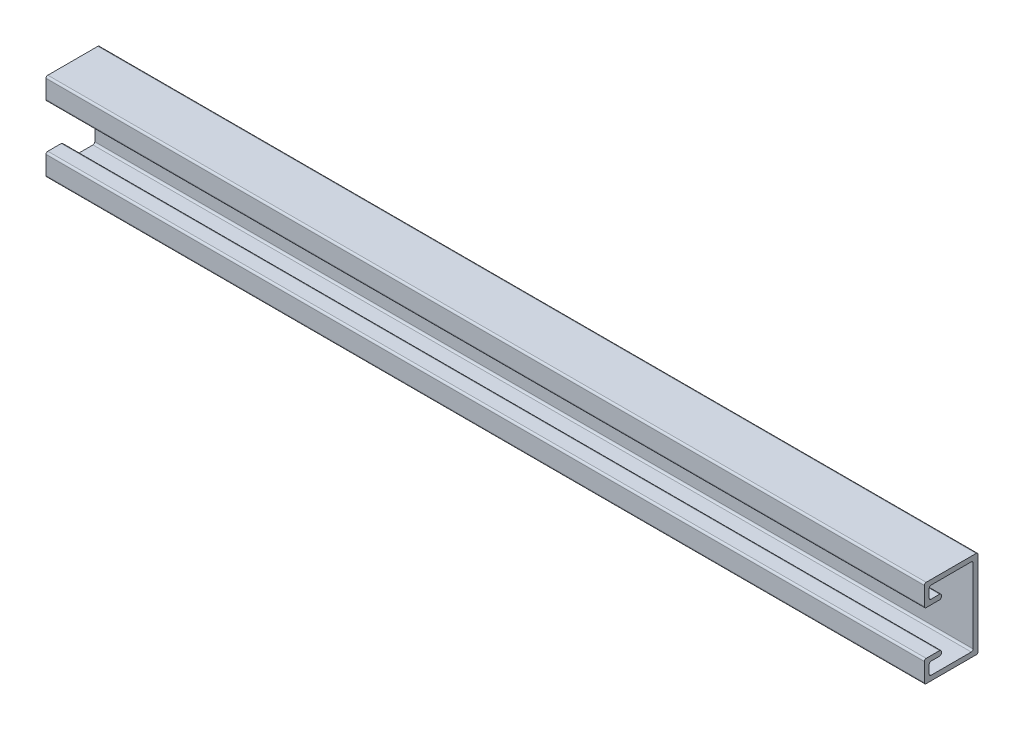
ISO-10303-21;
HEADER;
FILE_DESCRIPTION(('STEP AP214'),'2;1');
FILE_NAME('part.step','',(''),(''),'','','');
FILE_SCHEMA(('AUTOMOTIVE_DESIGN { 1 0 10303 214 1 1 1 1 }'));
ENDSEC;
DATA;
#1=APPLICATION_CONTEXT('core data for automotive mechanical design processes');
#2=APPLICATION_PROTOCOL_DEFINITION('international standard','automotive_design',2000,#1);
#3=PRODUCT_CONTEXT('',#1,'mechanical');
#4=PRODUCT('Part','Part','',(#3));
#5=PRODUCT_RELATED_PRODUCT_CATEGORY('part','',(#4));
#6=PRODUCT_DEFINITION_FORMATION('','',#4);
#7=PRODUCT_DEFINITION_CONTEXT('part definition',#1,'design');
#8=PRODUCT_DEFINITION('design','',#6,#7);
#9=PRODUCT_DEFINITION_SHAPE('','',#8);
#10=(LENGTH_UNIT() NAMED_UNIT(*) SI_UNIT(.MILLI.,.METRE.));
#11=(NAMED_UNIT(*) PLANE_ANGLE_UNIT() SI_UNIT($,.RADIAN.));
#12=(NAMED_UNIT(*) SI_UNIT($,.STERADIAN.) SOLID_ANGLE_UNIT());
#13=UNCERTAINTY_MEASURE_WITH_UNIT(LENGTH_MEASURE(1.E-05),#10,'distance_accuracy_value','');
#14=(GEOMETRIC_REPRESENTATION_CONTEXT(3) GLOBAL_UNCERTAINTY_ASSIGNED_CONTEXT((#13)) GLOBAL_UNIT_ASSIGNED_CONTEXT((#10,
#11,#12)) REPRESENTATION_CONTEXT('',''));
#15=CARTESIAN_POINT('',(0.,0.,0.));
#16=DIRECTION('',(0.,0.,1.));
#17=DIRECTION('',(1.,0.,0.));
#18=AXIS2_PLACEMENT_3D('',#15,#16,#17);
#19=CARTESIAN_POINT('',(914.4,12.7,45.72));
#20=DIRECTION('',(0.,1.,0.));
#21=DIRECTION('',(0.,0.,1.));
#22=AXIS2_PLACEMENT_3D('',#19,#20,#21);
#23=PLANE('',#22);
#24=DIRECTION('',(0.,0.,-1.));
#25=VECTOR('',#24,1.);
#26=CARTESIAN_POINT('',(914.4,12.7,45.72));
#27=LINE('',#26,#25);
#28=CARTESIAN_POINT('',(914.4,12.7,43.815));
#29=VERTEX_POINT('',#28);
#30=CARTESIAN_POINT('',(914.4,12.7,34.925));
#31=VERTEX_POINT('',#30);
#32=EDGE_CURVE('E263',#29,#31,#27,.T.);
#33=ORIENTED_EDGE('',*,*,#32,.F.);
#34=DIRECTION('',(-1.,0.,0.));
#35=VECTOR('',#34,1.);
#36=CARTESIAN_POINT('',(0.,12.7,43.815));
#37=LINE('',#36,#35);
#38=CARTESIAN_POINT('',(0.,12.7,43.815));
#39=VERTEX_POINT('',#38);
#40=EDGE_CURVE('E248',#29,#39,#37,.T.);
#41=ORIENTED_EDGE('',*,*,#40,.T.);
#42=DIRECTION('',(0.,0.,-1.));
#43=VECTOR('',#42,1.);
#44=CARTESIAN_POINT('',(0.,12.7,45.72));
#45=LINE('',#44,#43);
#46=CARTESIAN_POINT('',(0.,12.7,34.925));
#47=VERTEX_POINT('',#46);
#48=EDGE_CURVE('E260',#39,#47,#45,.T.);
#49=ORIENTED_EDGE('',*,*,#48,.T.);
#50=DIRECTION('',(-1.,0.,0.));
#51=VECTOR('',#50,1.);
#52=CARTESIAN_POINT('',(914.4,12.7,34.925));
#53=LINE('',#52,#51);
#54=EDGE_CURVE('E265',#47,#31,#53,.F.);
#55=ORIENTED_EDGE('',*,*,#54,.T.);
#56=EDGE_LOOP('',(#33,#41,#49,#55));
#57=FACE_BOUND('',#56,.T.);
#58=ADVANCED_FACE('F34',(#57),#23,.F.);
#59=CARTESIAN_POINT('',(914.4,17.78,33.02));
#60=DIRECTION('',(0.,0.,-1.));
#61=DIRECTION('',(-1.,0.,0.));
#62=AXIS2_PLACEMENT_3D('',#59,#60,#61);
#63=PLANE('',#62);
#64=DIRECTION('',(0.,-1.,0.));
#65=VECTOR('',#64,1.);
#66=CARTESIAN_POINT('',(914.4,17.78,33.02));
#67=LINE('',#66,#65);
#68=CARTESIAN_POINT('',(914.4,15.875,33.02));
#69=VERTEX_POINT('',#68);
#70=CARTESIAN_POINT('',(914.4,14.605,33.02));
#71=VERTEX_POINT('',#70);
#72=EDGE_CURVE('E496',#69,#71,#67,.T.);
#73=ORIENTED_EDGE('',*,*,#72,.T.);
#74=DIRECTION('',(-1.,0.,0.));
#75=VECTOR('',#74,1.);
#76=CARTESIAN_POINT('',(0.,14.605,33.02));
#77=LINE('',#76,#75);
#78=CARTESIAN_POINT('',(0.,14.605,33.02));
#79=VERTEX_POINT('',#78);
#80=EDGE_CURVE('E406',#71,#79,#77,.T.);
#81=ORIENTED_EDGE('',*,*,#80,.T.);
#82=DIRECTION('',(0.,-1.,0.));
#83=VECTOR('',#82,1.);
#84=CARTESIAN_POINT('',(0.,17.78,33.02));
#85=LINE('',#84,#83);
#86=CARTESIAN_POINT('',(0.,15.875,33.02));
#87=VERTEX_POINT('',#86);
#88=EDGE_CURVE('E271',#87,#79,#85,.T.);
#89=ORIENTED_EDGE('',*,*,#88,.F.);
#90=DIRECTION('',(-1.,0.,0.));
#91=VECTOR('',#90,1.);
#92=CARTESIAN_POINT('',(914.4,15.875,33.02));
#93=LINE('',#92,#91);
#94=EDGE_CURVE('E404',#87,#69,#93,.F.);
#95=ORIENTED_EDGE('',*,*,#94,.T.);
#96=EDGE_LOOP('',(#73,#81,#89,#95));
#97=FACE_BOUND('',#96,.T.);
#98=ADVANCED_FACE('F507',(#97),#63,.T.);
#99=CARTESIAN_POINT('',(914.4,17.78,45.72));
#100=DIRECTION('',(0.,1.,0.));
#101=DIRECTION('',(0.,0.,1.));
#102=AXIS2_PLACEMENT_3D('',#99,#100,#101);
#103=PLANE('',#102);
#104=DIRECTION('',(0.,0.,-1.));
#105=VECTOR('',#104,1.);
#106=CARTESIAN_POINT('',(0.,17.78,45.72));
#107=LINE('',#106,#105);
#108=CARTESIAN_POINT('',(0.,17.78,48.895));
#109=VERTEX_POINT('',#108);
#110=CARTESIAN_POINT('',(0.,17.78,34.925));
#111=VERTEX_POINT('',#110);
#112=EDGE_CURVE('E273',#109,#111,#107,.T.);
#113=ORIENTED_EDGE('',*,*,#112,.F.);
#114=DIRECTION('',(-1.,0.,0.));
#115=VECTOR('',#114,1.);
#116=CARTESIAN_POINT('',(914.4,17.78,48.895));
#117=LINE('',#116,#115);
#118=CARTESIAN_POINT('',(914.4,17.78,48.895));
#119=VERTEX_POINT('',#118);
#120=EDGE_CURVE('E402',#109,#119,#117,.F.);
#121=ORIENTED_EDGE('',*,*,#120,.T.);
#122=DIRECTION('',(0.,0.,-1.));
#123=VECTOR('',#122,1.);
#124=CARTESIAN_POINT('',(914.4,17.78,45.72));
#125=LINE('',#124,#123);
#126=CARTESIAN_POINT('',(914.4,17.78,34.925));
#127=VERTEX_POINT('',#126);
#128=EDGE_CURVE('E493',#119,#127,#125,.T.);
#129=ORIENTED_EDGE('',*,*,#128,.T.);
#130=DIRECTION('',(-1.,0.,0.));
#131=VECTOR('',#130,1.);
#132=CARTESIAN_POINT('',(914.4,17.78,34.925));
#133=LINE('',#132,#131);
#134=EDGE_CURVE('E399',#127,#111,#133,.T.);
#135=ORIENTED_EDGE('',*,*,#134,.T.);
#136=EDGE_LOOP('',(#113,#121,#129,#135));
#137=FACE_BOUND('',#136,.T.);
#138=ADVANCED_FACE('F515',(#137),#103,.T.);
#139=CARTESIAN_POINT('',(914.4,0.,50.8));
#140=DIRECTION('',(0.,0.,1.));
#141=DIRECTION('',(0.,-1.,0.));
#142=AXIS2_PLACEMENT_3D('',#139,#140,#141);
#143=PLANE('',#142);
#144=DIRECTION('',(0.,1.,0.));
#145=VECTOR('',#144,1.);
#146=CARTESIAN_POINT('',(0.,0.,50.8));
#147=LINE('',#146,#145);
#148=CARTESIAN_POINT('',(0.,-3.175,50.8));
#149=VERTEX_POINT('',#148);
#150=CARTESIAN_POINT('',(0.,15.875,50.8));
#151=VERTEX_POINT('',#150);
#152=EDGE_CURVE('E281',#149,#151,#147,.T.);
#153=ORIENTED_EDGE('',*,*,#152,.F.);
#154=DIRECTION('',(-1.,0.,0.));
#155=VECTOR('',#154,1.);
#156=CARTESIAN_POINT('',(914.4,-3.175,50.8));
#157=LINE('',#156,#155);
#158=CARTESIAN_POINT('',(914.4,-3.175,50.8));
#159=VERTEX_POINT('',#158);
#160=EDGE_CURVE('E378',#149,#159,#157,.F.);
#161=ORIENTED_EDGE('',*,*,#160,.T.);
#162=DIRECTION('',(0.,1.,0.));
#163=VECTOR('',#162,1.);
#164=CARTESIAN_POINT('',(914.4,0.,50.8));
#165=LINE('',#164,#163);
#166=CARTESIAN_POINT('',(914.4,15.875,50.8));
#167=VERTEX_POINT('',#166);
#168=EDGE_CURVE('E490',#159,#167,#165,.T.);
#169=ORIENTED_EDGE('',*,*,#168,.T.);
#170=DIRECTION('',(-1.,0.,0.));
#171=VECTOR('',#170,1.);
#172=CARTESIAN_POINT('',(914.4,15.875,50.8));
#173=LINE('',#172,#171);
#174=EDGE_CURVE('E375',#167,#151,#173,.T.);
#175=ORIENTED_EDGE('',*,*,#174,.T.);
#176=EDGE_LOOP('',(#153,#161,#169,#175));
#177=FACE_BOUND('',#176,.T.);
#178=ADVANCED_FACE('F525',(#177),#143,.T.);
#179=CARTESIAN_POINT('',(914.4,-5.08,0.));
#180=DIRECTION('',(0.,-1.,0.));
#181=DIRECTION('',(0.,0.,-1.));
#182=AXIS2_PLACEMENT_3D('',#179,#180,#181);
#183=PLANE('',#182);
#184=DIRECTION('',(0.,0.,-1.));
#185=VECTOR('',#184,1.);
#186=CARTESIAN_POINT('',(914.4,-5.08,0.));
#187=LINE('',#186,#185);
#188=CARTESIAN_POINT('',(914.4,-5.08,-3.175));
#189=VERTEX_POINT('',#188);
#190=CARTESIAN_POINT('',(914.4,-5.08,48.895));
#191=VERTEX_POINT('',#190);
#192=EDGE_CURVE('E487',#189,#191,#187,.F.);
#193=ORIENTED_EDGE('',*,*,#192,.T.);
#194=DIRECTION('',(-1.,0.,0.));
#195=VECTOR('',#194,1.);
#196=CARTESIAN_POINT('',(914.4,-5.08,48.895));
#197=LINE('',#196,#195);
#198=CARTESIAN_POINT('',(0.,-5.08,48.895));
#199=VERTEX_POINT('',#198);
#200=EDGE_CURVE('E372',#191,#199,#197,.T.);
#201=ORIENTED_EDGE('',*,*,#200,.T.);
#202=DIRECTION('',(0.,0.,-1.));
#203=VECTOR('',#202,1.);
#204=CARTESIAN_POINT('',(0.,-5.08,0.));
#205=LINE('',#204,#203);
#206=CARTESIAN_POINT('',(0.,-5.08,-3.175));
#207=VERTEX_POINT('',#206);
#208=EDGE_CURVE('E284',#207,#199,#205,.F.);
#209=ORIENTED_EDGE('',*,*,#208,.F.);
#210=DIRECTION('',(-1.,0.,0.));
#211=VECTOR('',#210,1.);
#212=CARTESIAN_POINT('',(914.4,-5.08,-3.175));
#213=LINE('',#212,#211);
#214=EDGE_CURVE('E370',#207,#189,#213,.F.);
#215=ORIENTED_EDGE('',*,*,#214,.T.);
#216=EDGE_LOOP('',(#193,#201,#209,#215));
#217=FACE_BOUND('',#216,.T.);
#218=ADVANCED_FACE('F533',(#217),#183,.T.);
#219=CARTESIAN_POINT('',(914.4,0.,-5.08));
#220=DIRECTION('',(0.,0.,-1.));
#221=DIRECTION('',(-1.,0.,0.));
#222=AXIS2_PLACEMENT_3D('',#219,#220,#221);
#223=PLANE('',#222);
#224=DIRECTION('',(0.,1.,0.));
#225=VECTOR('',#224,1.);
#226=CARTESIAN_POINT('',(914.4,0.,-5.08));
#227=LINE('',#226,#225);
#228=CARTESIAN_POINT('',(914.4,84.455,-5.08));
#229=VERTEX_POINT('',#228);
#230=CARTESIAN_POINT('',(914.4,-3.175,-5.08));
#231=VERTEX_POINT('',#230);
#232=EDGE_CURVE('E484',#229,#231,#227,.F.);
#233=ORIENTED_EDGE('',*,*,#232,.T.);
#234=DIRECTION('',(-1.,0.,0.));
#235=VECTOR('',#234,1.);
#236=CARTESIAN_POINT('',(914.4,-3.175,-5.08));
#237=LINE('',#236,#235);
#238=CARTESIAN_POINT('',(0.,-3.175,-5.08));
#239=VERTEX_POINT('',#238);
#240=EDGE_CURVE('E391',#231,#239,#237,.T.);
#241=ORIENTED_EDGE('',*,*,#240,.T.);
#242=DIRECTION('',(0.,1.,0.));
#243=VECTOR('',#242,1.);
#244=CARTESIAN_POINT('',(0.,0.,-5.08));
#245=LINE('',#244,#243);
#246=CARTESIAN_POINT('',(0.,84.455,-5.08));
#247=VERTEX_POINT('',#246);
#248=EDGE_CURVE('E287',#247,#239,#245,.F.);
#249=ORIENTED_EDGE('',*,*,#248,.F.);
#250=DIRECTION('',(-1.,0.,0.));
#251=VECTOR('',#250,1.);
#252=CARTESIAN_POINT('',(914.4,84.455,-5.08));
#253=LINE('',#252,#251);
#254=EDGE_CURVE('E389',#247,#229,#253,.F.);
#255=ORIENTED_EDGE('',*,*,#254,.T.);
#256=EDGE_LOOP('',(#233,#241,#249,#255));
#257=FACE_BOUND('',#256,.T.);
#258=ADVANCED_FACE('F543',(#257),#223,.T.);
#259=CARTESIAN_POINT('',(914.4,86.36,0.));
#260=DIRECTION('',(0.,1.,0.));
#261=DIRECTION('',(0.,0.,1.));
#262=AXIS2_PLACEMENT_3D('',#259,#260,#261);
#263=PLANE('',#262);
#264=DIRECTION('',(0.,0.,-1.));
#265=VECTOR('',#264,1.);
#266=CARTESIAN_POINT('',(0.,86.36,0.));
#267=LINE('',#266,#265);
#268=CARTESIAN_POINT('',(0.,86.36,48.895));
#269=VERTEX_POINT('',#268);
#270=CARTESIAN_POINT('',(0.,86.36,-3.175));
#271=VERTEX_POINT('',#270);
#272=EDGE_CURVE('E290',#269,#271,#267,.T.);
#273=ORIENTED_EDGE('',*,*,#272,.F.);
#274=DIRECTION('',(-1.,0.,0.));
#275=VECTOR('',#274,1.);
#276=CARTESIAN_POINT('',(914.4,86.36,48.895));
#277=LINE('',#276,#275);
#278=CARTESIAN_POINT('',(914.4,86.36,48.895));
#279=VERTEX_POINT('',#278);
#280=EDGE_CURVE('E397',#269,#279,#277,.F.);
#281=ORIENTED_EDGE('',*,*,#280,.T.);
#282=DIRECTION('',(0.,0.,-1.));
#283=VECTOR('',#282,1.);
#284=CARTESIAN_POINT('',(914.4,86.36,0.));
#285=LINE('',#284,#283);
#286=CARTESIAN_POINT('',(914.4,86.36,-3.175));
#287=VERTEX_POINT('',#286);
#288=EDGE_CURVE('E481',#279,#287,#285,.T.);
#289=ORIENTED_EDGE('',*,*,#288,.T.);
#290=DIRECTION('',(-1.,0.,0.));
#291=VECTOR('',#290,1.);
#292=CARTESIAN_POINT('',(914.4,86.36,-3.175));
#293=LINE('',#292,#291);
#294=EDGE_CURVE('E394',#287,#271,#293,.T.);
#295=ORIENTED_EDGE('',*,*,#294,.T.);
#296=EDGE_LOOP('',(#273,#281,#289,#295));
#297=FACE_BOUND('',#296,.T.);
#298=ADVANCED_FACE('F551',(#297),#263,.T.);
#299=CARTESIAN_POINT('',(914.4,81.28,50.8));
#300=DIRECTION('',(0.,0.,1.));
#301=DIRECTION('',(1.,0.,0.));
#302=AXIS2_PLACEMENT_3D('',#299,#300,#301);
#303=PLANE('',#302);
#304=DIRECTION('',(0.,1.,0.));
#305=VECTOR('',#304,1.);
#306=CARTESIAN_POINT('',(0.,81.28,50.8));
#307=LINE('',#306,#305);
#308=CARTESIAN_POINT('',(0.,65.405,50.8));
#309=VERTEX_POINT('',#308);
#310=CARTESIAN_POINT('',(0.,84.455,50.8));
#311=VERTEX_POINT('',#310);
#312=EDGE_CURVE('E293',#309,#311,#307,.T.);
#313=ORIENTED_EDGE('',*,*,#312,.F.);
#314=DIRECTION('',(-1.,0.,0.));
#315=VECTOR('',#314,1.);
#316=CARTESIAN_POINT('',(914.4,65.405,50.8));
#317=LINE('',#316,#315);
#318=CARTESIAN_POINT('',(914.4,65.405,50.8));
#319=VERTEX_POINT('',#318);
#320=EDGE_CURVE('E348',#309,#319,#317,.F.);
#321=ORIENTED_EDGE('',*,*,#320,.T.);
#322=DIRECTION('',(0.,1.,0.));
#323=VECTOR('',#322,1.);
#324=CARTESIAN_POINT('',(914.4,81.28,50.8));
#325=LINE('',#324,#323);
#326=CARTESIAN_POINT('',(914.4,84.455,50.8));
#327=VERTEX_POINT('',#326);
#328=EDGE_CURVE('E478',#319,#327,#325,.T.);
#329=ORIENTED_EDGE('',*,*,#328,.T.);
#330=DIRECTION('',(-1.,0.,0.));
#331=VECTOR('',#330,1.);
#332=CARTESIAN_POINT('',(914.4,84.455,50.8));
#333=LINE('',#332,#331);
#334=EDGE_CURVE('E345',#327,#311,#333,.T.);
#335=ORIENTED_EDGE('',*,*,#334,.T.);
#336=EDGE_LOOP('',(#313,#321,#329,#335));
#337=FACE_BOUND('',#336,.T.);
#338=ADVANCED_FACE('F560',(#337),#303,.T.);
#339=CARTESIAN_POINT('',(914.4,63.5,45.72));
#340=DIRECTION('',(0.,-1.,0.));
#341=DIRECTION('',(0.,0.,-1.));
#342=AXIS2_PLACEMENT_3D('',#339,#340,#341);
#343=PLANE('',#342);
#344=DIRECTION('',(0.,0.,-1.));
#345=VECTOR('',#344,1.);
#346=CARTESIAN_POINT('',(914.4,63.5,45.72));
#347=LINE('',#346,#345);
#348=CARTESIAN_POINT('',(914.4,63.5,34.925));
#349=VERTEX_POINT('',#348);
#350=CARTESIAN_POINT('',(914.4,63.5,48.895));
#351=VERTEX_POINT('',#350);
#352=EDGE_CURVE('E475',#349,#351,#347,.F.);
#353=ORIENTED_EDGE('',*,*,#352,.T.);
#354=DIRECTION('',(-1.,0.,0.));
#355=VECTOR('',#354,1.);
#356=CARTESIAN_POINT('',(914.4,63.5,48.895));
#357=LINE('',#356,#355);
#358=CARTESIAN_POINT('',(0.,63.5,48.895));
#359=VERTEX_POINT('',#358);
#360=EDGE_CURVE('E323',#351,#359,#357,.T.);
#361=ORIENTED_EDGE('',*,*,#360,.T.);
#362=DIRECTION('',(0.,0.,-1.));
#363=VECTOR('',#362,1.);
#364=CARTESIAN_POINT('',(0.,63.5,45.72));
#365=LINE('',#364,#363);
#366=CARTESIAN_POINT('',(0.,63.5,34.925));
#367=VERTEX_POINT('',#366);
#368=EDGE_CURVE('E296',#367,#359,#365,.F.);
#369=ORIENTED_EDGE('',*,*,#368,.F.);
#370=DIRECTION('',(-1.,0.,0.));
#371=VECTOR('',#370,1.);
#372=CARTESIAN_POINT('',(914.4,63.5,34.925));
#373=LINE('',#372,#371);
#374=EDGE_CURVE('E321',#367,#349,#373,.F.);
#375=ORIENTED_EDGE('',*,*,#374,.T.);
#376=EDGE_LOOP('',(#353,#361,#369,#375));
#377=FACE_BOUND('',#376,.T.);
#378=ADVANCED_FACE('F568',(#377),#343,.T.);
#379=CARTESIAN_POINT('',(914.4,68.58,33.02));
#380=DIRECTION('',(0.,0.,-1.));
#381=DIRECTION('',(-1.,0.,0.));
#382=AXIS2_PLACEMENT_3D('',#379,#380,#381);
#383=PLANE('',#382);
#384=DIRECTION('',(0.,-1.,0.));
#385=VECTOR('',#384,1.);
#386=CARTESIAN_POINT('',(914.4,68.58,33.02));
#387=LINE('',#386,#385);
#388=CARTESIAN_POINT('',(914.4,66.675,33.02));
#389=VERTEX_POINT('',#388);
#390=CARTESIAN_POINT('',(914.4,65.405,33.02));
#391=VERTEX_POINT('',#390);
#392=EDGE_CURVE('E472',#389,#391,#387,.T.);
#393=ORIENTED_EDGE('',*,*,#392,.T.);
#394=DIRECTION('',(-1.,0.,0.));
#395=VECTOR('',#394,1.);
#396=CARTESIAN_POINT('',(914.4,65.405,33.02));
#397=LINE('',#396,#395);
#398=CARTESIAN_POINT('',(0.,65.405,33.02));
#399=VERTEX_POINT('',#398);
#400=EDGE_CURVE('E411',#391,#399,#397,.T.);
#401=ORIENTED_EDGE('',*,*,#400,.T.);
#402=DIRECTION('',(0.,-1.,0.));
#403=VECTOR('',#402,1.);
#404=CARTESIAN_POINT('',(0.,68.58,33.02));
#405=LINE('',#404,#403);
#406=CARTESIAN_POINT('',(0.,66.675,33.02));
#407=VERTEX_POINT('',#406);
#408=EDGE_CURVE('E298',#407,#399,#405,.T.);
#409=ORIENTED_EDGE('',*,*,#408,.F.);
#410=DIRECTION('',(-1.,0.,0.));
#411=VECTOR('',#410,1.);
#412=CARTESIAN_POINT('',(914.4,66.675,33.02));
#413=LINE('',#412,#411);
#414=EDGE_CURVE('E409',#407,#389,#413,.F.);
#415=ORIENTED_EDGE('',*,*,#414,.T.);
#416=EDGE_LOOP('',(#393,#401,#409,#415));
#417=FACE_BOUND('',#416,.T.);
#418=ADVANCED_FACE('F578',(#417),#383,.T.);
#419=CARTESIAN_POINT('',(914.4,68.58,45.72));
#420=DIRECTION('',(0.,-1.,0.));
#421=DIRECTION('',(0.,0.,-1.));
#422=AXIS2_PLACEMENT_3D('',#419,#420,#421);
#423=PLANE('',#422);
#424=DIRECTION('',(0.,0.,1.));
#425=VECTOR('',#424,1.);
#426=CARTESIAN_POINT('',(914.4,68.58,45.72));
#427=LINE('',#426,#425);
#428=CARTESIAN_POINT('',(914.4,68.58,34.925));
#429=VERTEX_POINT('',#428);
#430=CARTESIAN_POINT('',(914.4,68.58,43.815));
#431=VERTEX_POINT('',#430);
#432=EDGE_CURVE('E469',#429,#431,#427,.T.);
#433=ORIENTED_EDGE('',*,*,#432,.F.);
#434=DIRECTION('',(-1.,0.,0.));
#435=VECTOR('',#434,1.);
#436=CARTESIAN_POINT('',(0.,68.58,34.925));
#437=LINE('',#436,#435);
#438=CARTESIAN_POINT('',(0.,68.58,34.925));
#439=VERTEX_POINT('',#438);
#440=EDGE_CURVE('E416',#429,#439,#437,.T.);
#441=ORIENTED_EDGE('',*,*,#440,.T.);
#442=DIRECTION('',(0.,0.,1.));
#443=VECTOR('',#442,1.);
#444=CARTESIAN_POINT('',(0.,68.58,45.72));
#445=LINE('',#444,#443);
#446=CARTESIAN_POINT('',(0.,68.58,43.815));
#447=VERTEX_POINT('',#446);
#448=EDGE_CURVE('E301',#439,#447,#445,.T.);
#449=ORIENTED_EDGE('',*,*,#448,.T.);
#450=DIRECTION('',(-1.,0.,0.));
#451=VECTOR('',#450,1.);
#452=CARTESIAN_POINT('',(914.4,68.58,43.815));
#453=LINE('',#452,#451);
#454=EDGE_CURVE('E414',#447,#431,#453,.F.);
#455=ORIENTED_EDGE('',*,*,#454,.T.);
#456=EDGE_LOOP('',(#433,#441,#449,#455));
#457=FACE_BOUND('',#456,.T.);
#458=ADVANCED_FACE('F587',(#457),#423,.F.);
#459=CARTESIAN_POINT('',(914.4,81.28,45.72));
#460=DIRECTION('',(0.,0.,1.));
#461=DIRECTION('',(1.,0.,0.));
#462=AXIS2_PLACEMENT_3D('',#459,#460,#461);
#463=PLANE('',#462);
#464=DIRECTION('',(0.,1.,0.));
#465=VECTOR('',#464,1.);
#466=CARTESIAN_POINT('',(914.4,81.28,45.72));
#467=LINE('',#466,#465);
#468=CARTESIAN_POINT('',(914.4,70.485,45.72));
#469=VERTEX_POINT('',#468);
#470=CARTESIAN_POINT('',(914.4,79.375,45.72));
#471=VERTEX_POINT('',#470);
#472=EDGE_CURVE('E464',#469,#471,#467,.T.);
#473=ORIENTED_EDGE('',*,*,#472,.F.);
#474=DIRECTION('',(-1.,0.,0.));
#475=VECTOR('',#474,1.);
#476=CARTESIAN_POINT('',(0.,70.485,45.72));
#477=LINE('',#476,#475);
#478=CARTESIAN_POINT('',(0.,70.485,45.72));
#479=VERTEX_POINT('',#478);
#480=EDGE_CURVE('E421',#469,#479,#477,.T.);
#481=ORIENTED_EDGE('',*,*,#480,.T.);
#482=DIRECTION('',(0.,1.,0.));
#483=VECTOR('',#482,1.);
#484=CARTESIAN_POINT('',(0.,81.28,45.72));
#485=LINE('',#484,#483);
#486=CARTESIAN_POINT('',(0.,79.375,45.72));
#487=VERTEX_POINT('',#486);
#488=EDGE_CURVE('E304',#479,#487,#485,.T.);
#489=ORIENTED_EDGE('',*,*,#488,.T.);
#490=DIRECTION('',(-1.,0.,0.));
#491=VECTOR('',#490,1.);
#492=CARTESIAN_POINT('',(914.4,79.375,45.72));
#493=LINE('',#492,#491);
#494=EDGE_CURVE('E419',#487,#471,#493,.F.);
#495=ORIENTED_EDGE('',*,*,#494,.T.);
#496=EDGE_LOOP('',(#473,#481,#489,#495));
#497=FACE_BOUND('',#496,.T.);
#498=ADVANCED_FACE('F596',(#497),#463,.F.);
#499=CARTESIAN_POINT('',(914.4,81.28,0.));
#500=DIRECTION('',(0.,1.,0.));
#501=DIRECTION('',(0.,0.,1.));
#502=AXIS2_PLACEMENT_3D('',#499,#500,#501);
#503=PLANE('',#502);
#504=DIRECTION('',(0.,0.,-1.));
#505=VECTOR('',#504,1.);
#506=CARTESIAN_POINT('',(914.4,81.28,0.));
#507=LINE('',#506,#505);
#508=CARTESIAN_POINT('',(914.4,81.28,43.815));
#509=VERTEX_POINT('',#508);
#510=CARTESIAN_POINT('',(914.4,81.28,1.905));
#511=VERTEX_POINT('',#510);
#512=EDGE_CURVE('E458',#509,#511,#507,.T.);
#513=ORIENTED_EDGE('',*,*,#512,.F.);
#514=DIRECTION('',(-1.,0.,0.));
#515=VECTOR('',#514,1.);
#516=CARTESIAN_POINT('',(0.,81.28,43.815));
#517=LINE('',#516,#515);
#518=CARTESIAN_POINT('',(0.,81.28,43.815));
#519=VERTEX_POINT('',#518);
#520=EDGE_CURVE('E255',#509,#519,#517,.T.);
#521=ORIENTED_EDGE('',*,*,#520,.T.);
#522=DIRECTION('',(0.,0.,-1.));
#523=VECTOR('',#522,1.);
#524=CARTESIAN_POINT('',(0.,81.28,0.));
#525=LINE('',#524,#523);
#526=CARTESIAN_POINT('',(0.,81.28,1.905));
#527=VERTEX_POINT('',#526);
#528=EDGE_CURVE('E307',#519,#527,#525,.T.);
#529=ORIENTED_EDGE('',*,*,#528,.T.);
#530=DIRECTION('',(-1.,0.,0.));
#531=VECTOR('',#530,1.);
#532=CARTESIAN_POINT('',(914.4,81.28,1.905));
#533=LINE('',#532,#531);
#534=EDGE_CURVE('E424',#527,#511,#533,.F.);
#535=ORIENTED_EDGE('',*,*,#534,.T.);
#536=EDGE_LOOP('',(#513,#521,#529,#535));
#537=FACE_BOUND('',#536,.T.);
#538=ADVANCED_FACE('F450',(#537),#503,.F.);
#539=CARTESIAN_POINT('',(914.4,0.,0.));
#540=DIRECTION('',(0.,0.,-1.));
#541=DIRECTION('',(-1.,0.,0.));
#542=AXIS2_PLACEMENT_3D('',#539,#540,#541);
#543=PLANE('',#542);
#544=DIRECTION('',(0.,-1.,0.));
#545=VECTOR('',#544,1.);
#546=CARTESIAN_POINT('',(0.,0.,0.));
#547=LINE('',#546,#545);
#548=CARTESIAN_POINT('',(0.,79.375,0.));
#549=VERTEX_POINT('',#548);
#550=CARTESIAN_POINT('',(0.,1.905,0.));
#551=VERTEX_POINT('',#550);
#552=EDGE_CURVE('E310',#549,#551,#547,.T.);
#553=ORIENTED_EDGE('',*,*,#552,.T.);
#554=DIRECTION('',(-1.,0.,0.));
#555=VECTOR('',#554,1.);
#556=CARTESIAN_POINT('',(914.4,1.905,0.));
#557=LINE('',#556,#555);
#558=CARTESIAN_POINT('',(914.4,1.905,0.));
#559=VERTEX_POINT('',#558);
#560=EDGE_CURVE('E387',#551,#559,#557,.F.);
#561=ORIENTED_EDGE('',*,*,#560,.T.);
#562=DIRECTION('',(0.,-1.,0.));
#563=VECTOR('',#562,1.);
#564=CARTESIAN_POINT('',(914.4,0.,0.));
#565=LINE('',#564,#563);
#566=CARTESIAN_POINT('',(914.4,79.375,0.));
#567=VERTEX_POINT('',#566);
#568=EDGE_CURVE('E457',#567,#559,#565,.T.);
#569=ORIENTED_EDGE('',*,*,#568,.F.);
#570=DIRECTION('',(-1.,0.,0.));
#571=VECTOR('',#570,1.);
#572=CARTESIAN_POINT('',(0.,79.375,0.));
#573=LINE('',#572,#571);
#574=EDGE_CURVE('E384',#567,#549,#573,.T.);
#575=ORIENTED_EDGE('',*,*,#574,.T.);
#576=EDGE_LOOP('',(#553,#561,#569,#575));
#577=FACE_BOUND('',#576,.T.);
#578=ADVANCED_FACE('F460',(#577),#543,.F.);
#579=CARTESIAN_POINT('',(914.4,0.,0.));
#580=DIRECTION('',(0.,-1.,0.));
#581=DIRECTION('',(0.,0.,-1.));
#582=AXIS2_PLACEMENT_3D('',#579,#580,#581);
#583=PLANE('',#582);
#584=DIRECTION('',(0.,0.,1.));
#585=VECTOR('',#584,1.);
#586=CARTESIAN_POINT('',(914.4,0.,0.));
#587=LINE('',#586,#585);
#588=CARTESIAN_POINT('',(914.4,0.,1.905));
#589=VERTEX_POINT('',#588);
#590=CARTESIAN_POINT('',(914.4,0.,43.815));
#591=VERTEX_POINT('',#590);
#592=EDGE_CURVE('E462',#589,#591,#587,.T.);
#593=ORIENTED_EDGE('',*,*,#592,.F.);
#594=DIRECTION('',(-1.,0.,0.));
#595=VECTOR('',#594,1.);
#596=CARTESIAN_POINT('',(0.,0.,1.905));
#597=LINE('',#596,#595);
#598=CARTESIAN_POINT('',(0.,0.,1.905));
#599=VERTEX_POINT('',#598);
#600=EDGE_CURVE('E381',#589,#599,#597,.T.);
#601=ORIENTED_EDGE('',*,*,#600,.T.);
#602=DIRECTION('',(0.,0.,1.));
#603=VECTOR('',#602,1.);
#604=CARTESIAN_POINT('',(0.,0.,0.));
#605=LINE('',#604,#603);
#606=CARTESIAN_POINT('',(0.,0.,43.815));
#607=VERTEX_POINT('',#606);
#608=EDGE_CURVE('E313',#599,#607,#605,.T.);
#609=ORIENTED_EDGE('',*,*,#608,.T.);
#610=DIRECTION('',(-1.,0.,0.));
#611=VECTOR('',#610,1.);
#612=CARTESIAN_POINT('',(914.4,0.,43.815));
#613=LINE('',#612,#611);
#614=EDGE_CURVE('E49',#607,#591,#613,.F.);
#615=ORIENTED_EDGE('',*,*,#614,.T.);
#616=EDGE_LOOP('',(#593,#601,#609,#615));
#617=FACE_BOUND('',#616,.T.);
#618=ADVANCED_FACE('F748',(#617),#583,.F.);
#619=CARTESIAN_POINT('',(914.4,0.,45.72));
#620=DIRECTION('',(0.,0.,1.));
#621=DIRECTION('',(0.,-1.,0.));
#622=AXIS2_PLACEMENT_3D('',#619,#620,#621);
#623=PLANE('',#622);
#624=DIRECTION('',(0.,1.,0.));
#625=VECTOR('',#624,1.);
#626=CARTESIAN_POINT('',(0.,0.,45.72));
#627=LINE('',#626,#625);
#628=CARTESIAN_POINT('',(0.,1.905,45.72));
#629=VERTEX_POINT('',#628);
#630=CARTESIAN_POINT('',(0.,10.795,45.72));
#631=VERTEX_POINT('',#630);
#632=EDGE_CURVE('E315',#629,#631,#627,.T.);
#633=ORIENTED_EDGE('',*,*,#632,.T.);
#634=DIRECTION('',(-1.,0.,0.));
#635=VECTOR('',#634,1.);
#636=CARTESIAN_POINT('',(914.4,10.795,45.72));
#637=LINE('',#636,#635);
#638=CARTESIAN_POINT('',(914.4,10.795,45.72));
#639=VERTEX_POINT('',#638);
#640=EDGE_CURVE('E249',#631,#639,#637,.F.);
#641=ORIENTED_EDGE('',*,*,#640,.T.);
#642=DIRECTION('',(0.,1.,0.));
#643=VECTOR('',#642,1.);
#644=CARTESIAN_POINT('',(914.4,0.,45.72));
#645=LINE('',#644,#643);
#646=CARTESIAN_POINT('',(914.4,1.905,45.72));
#647=VERTEX_POINT('',#646);
#648=EDGE_CURVE('E276',#647,#639,#645,.T.);
#649=ORIENTED_EDGE('',*,*,#648,.F.);
#650=DIRECTION('',(-1.,0.,0.));
#651=VECTOR('',#650,1.);
#652=CARTESIAN_POINT('',(0.,1.905,45.72));
#653=LINE('',#652,#651);
#654=EDGE_CURVE('E264',#647,#629,#653,.T.);
#655=ORIENTED_EDGE('',*,*,#654,.T.);
#656=EDGE_LOOP('',(#633,#641,#649,#655));
#657=FACE_BOUND('',#656,.T.);
#658=ADVANCED_FACE('F740',(#657),#623,.F.);
#659=CARTESIAN_POINT('',(914.4,0.,0.));
#660=DIRECTION('',(-1.,0.,0.));
#661=DIRECTION('',(0.,0.,1.));
#662=AXIS2_PLACEMENT_3D('',#659,#660,#661);
#663=PLANE('',#662);
#664=ORIENTED_EDGE('',*,*,#328,.F.);
#665=CARTESIAN_POINT('',(914.4,65.405,48.895));
#666=DIRECTION('',(-1.,0.,0.));
#667=DIRECTION('',(0.,0.,1.));
#668=AXIS2_PLACEMENT_3D('',#665,#666,#667);
#669=CIRCLE('',#668,1.905);
#670=EDGE_CURVE('E368',#319,#351,#669,.F.);
#671=ORIENTED_EDGE('',*,*,#670,.T.);
#672=ORIENTED_EDGE('',*,*,#352,.F.);
#673=CARTESIAN_POINT('',(914.4,65.405,34.925));
#674=DIRECTION('',(-1.,0.,0.));
#675=DIRECTION('',(0.,0.,1.));
#676=AXIS2_PLACEMENT_3D('',#673,#674,#675);
#677=CIRCLE('',#676,1.905);
#678=EDGE_CURVE('E352',#349,#391,#677,.F.);
#679=ORIENTED_EDGE('',*,*,#678,.T.);
#680=ORIENTED_EDGE('',*,*,#392,.F.);
#681=CARTESIAN_POINT('',(914.4,66.675,34.925));
#682=DIRECTION('',(-1.,0.,0.));
#683=DIRECTION('',(0.,0.,1.));
#684=AXIS2_PLACEMENT_3D('',#681,#682,#683);
#685=CIRCLE('',#684,1.905);
#686=EDGE_CURVE('E350',#389,#429,#685,.F.);
#687=ORIENTED_EDGE('',*,*,#686,.T.);
#688=ORIENTED_EDGE('',*,*,#432,.T.);
#689=CARTESIAN_POINT('',(914.4,70.485,43.815));
#690=DIRECTION('',(-1.,0.,0.));
#691=DIRECTION('',(0.,0.,1.));
#692=AXIS2_PLACEMENT_3D('',#689,#690,#691);
#693=CIRCLE('',#692,1.905);
#694=EDGE_CURVE('E438',#431,#469,#693,.T.);
#695=ORIENTED_EDGE('',*,*,#694,.T.);
#696=ORIENTED_EDGE('',*,*,#472,.T.);
#697=CARTESIAN_POINT('',(914.4,79.375,43.815));
#698=DIRECTION('',(-1.,0.,0.));
#699=DIRECTION('',(0.,0.,1.));
#700=AXIS2_PLACEMENT_3D('',#697,#698,#699);
#701=CIRCLE('',#700,1.905);
#702=EDGE_CURVE('E442',#471,#509,#701,.T.);
#703=ORIENTED_EDGE('',*,*,#702,.T.);
#704=ORIENTED_EDGE('',*,*,#512,.T.);
#705=CARTESIAN_POINT('',(914.4,79.375,1.905));
#706=DIRECTION('',(-1.,0.,0.));
#707=DIRECTION('',(0.,0.,1.));
#708=AXIS2_PLACEMENT_3D('',#705,#706,#707);
#709=CIRCLE('',#708,1.905);
#710=EDGE_CURVE('E11',#511,#567,#709,.T.);
#711=ORIENTED_EDGE('',*,*,#710,.T.);
#712=ORIENTED_EDGE('',*,*,#568,.T.);
#713=CARTESIAN_POINT('',(914.4,1.905,1.905));
#714=DIRECTION('',(-1.,0.,0.));
#715=DIRECTION('',(0.,0.,1.));
#716=AXIS2_PLACEMENT_3D('',#713,#714,#715);
#717=CIRCLE('',#716,1.905);
#718=EDGE_CURVE('E56',#559,#589,#717,.T.);
#719=ORIENTED_EDGE('',*,*,#718,.T.);
#720=ORIENTED_EDGE('',*,*,#592,.T.);
#721=CARTESIAN_POINT('',(914.4,1.905,43.815));
#722=DIRECTION('',(-1.,0.,0.));
#723=DIRECTION('',(0.,0.,1.));
#724=AXIS2_PLACEMENT_3D('',#721,#722,#723);
#725=CIRCLE('',#724,1.905);
#726=EDGE_CURVE('E434',#591,#647,#725,.T.);
#727=ORIENTED_EDGE('',*,*,#726,.T.);
#728=ORIENTED_EDGE('',*,*,#648,.T.);
#729=CARTESIAN_POINT('',(914.4,10.795,43.815));
#730=DIRECTION('',(-1.,0.,0.));
#731=DIRECTION('',(0.,0.,1.));
#732=AXIS2_PLACEMENT_3D('',#729,#730,#731);
#733=CIRCLE('',#732,1.905);
#734=EDGE_CURVE('E254',#639,#29,#733,.T.);
#735=ORIENTED_EDGE('',*,*,#734,.T.);
#736=ORIENTED_EDGE('',*,*,#32,.T.);
#737=CARTESIAN_POINT('',(914.4,14.605,34.925));
#738=DIRECTION('',(-1.,0.,0.));
#739=DIRECTION('',(0.,0.,1.));
#740=AXIS2_PLACEMENT_3D('',#737,#738,#739);
#741=CIRCLE('',#740,1.905);
#742=EDGE_CURVE('E356',#31,#71,#741,.F.);
#743=ORIENTED_EDGE('',*,*,#742,.T.);
#744=ORIENTED_EDGE('',*,*,#72,.F.);
#745=CARTESIAN_POINT('',(914.4,15.875,34.925));
#746=DIRECTION('',(-1.,0.,0.));
#747=DIRECTION('',(0.,0.,1.));
#748=AXIS2_PLACEMENT_3D('',#745,#746,#747);
#749=CIRCLE('',#748,1.905);
#750=EDGE_CURVE('E354',#69,#127,#749,.F.);
#751=ORIENTED_EDGE('',*,*,#750,.T.);
#752=ORIENTED_EDGE('',*,*,#128,.F.);
#753=CARTESIAN_POINT('',(914.4,15.875,48.895));
#754=DIRECTION('',(-1.,0.,0.));
#755=DIRECTION('',(0.,0.,1.));
#756=AXIS2_PLACEMENT_3D('',#753,#754,#755);
#757=CIRCLE('',#756,1.905);
#758=EDGE_CURVE('E358',#119,#167,#757,.F.);
#759=ORIENTED_EDGE('',*,*,#758,.T.);
#760=ORIENTED_EDGE('',*,*,#168,.F.);
#761=CARTESIAN_POINT('',(914.4,-3.175,48.895));
#762=DIRECTION('',(-1.,0.,0.));
#763=DIRECTION('',(0.,0.,1.));
#764=AXIS2_PLACEMENT_3D('',#761,#762,#763);
#765=CIRCLE('',#764,1.905);
#766=EDGE_CURVE('E366',#159,#191,#765,.F.);
#767=ORIENTED_EDGE('',*,*,#766,.T.);
#768=ORIENTED_EDGE('',*,*,#192,.F.);
#769=CARTESIAN_POINT('',(914.4,-3.175,-3.175));
#770=DIRECTION('',(-1.,0.,0.));
#771=DIRECTION('',(0.,0.,1.));
#772=AXIS2_PLACEMENT_3D('',#769,#770,#771);
#773=CIRCLE('',#772,1.905);
#774=EDGE_CURVE('E364',#189,#231,#773,.F.);
#775=ORIENTED_EDGE('',*,*,#774,.T.);
#776=ORIENTED_EDGE('',*,*,#232,.F.);
#777=CARTESIAN_POINT('',(914.4,84.455,-3.175));
#778=DIRECTION('',(-1.,0.,0.));
#779=DIRECTION('',(0.,0.,1.));
#780=AXIS2_PLACEMENT_3D('',#777,#778,#779);
#781=CIRCLE('',#780,1.905);
#782=EDGE_CURVE('E360',#229,#287,#781,.F.);
#783=ORIENTED_EDGE('',*,*,#782,.T.);
#784=ORIENTED_EDGE('',*,*,#288,.F.);
#785=CARTESIAN_POINT('',(914.4,84.455,48.895));
#786=DIRECTION('',(-1.,0.,0.));
#787=DIRECTION('',(0.,0.,1.));
#788=AXIS2_PLACEMENT_3D('',#785,#786,#787);
#789=CIRCLE('',#788,1.905);
#790=EDGE_CURVE('E362',#279,#327,#789,.F.);
#791=ORIENTED_EDGE('',*,*,#790,.T.);
#792=EDGE_LOOP('',(#664,#671,#672,#679,#680,#687,#688,#695,#696,#703,#704,#711,#712,#719,#720,
#727,#728,#735,#736,#743,#744,#751,#752,#759,#760,#767,#768,#775,#776,#783,#784,#791));
#793=FACE_BOUND('',#792,.T.);
#794=ADVANCED_FACE('F456',(#793),#663,.F.);
#795=CARTESIAN_POINT('',(0.,0.,0.));
#796=DIRECTION('',(-1.,0.,0.));
#797=DIRECTION('',(0.,0.,1.));
#798=AXIS2_PLACEMENT_3D('',#795,#796,#797);
#799=PLANE('',#798);
#800=ORIENTED_EDGE('',*,*,#368,.T.);
#801=CARTESIAN_POINT('',(0.,65.405,48.895));
#802=DIRECTION('',(-1.,0.,0.));
#803=DIRECTION('',(0.,0.,1.));
#804=AXIS2_PLACEMENT_3D('',#801,#802,#803);
#805=CIRCLE('',#804,1.905);
#806=EDGE_CURVE('E343',#359,#309,#805,.T.);
#807=ORIENTED_EDGE('',*,*,#806,.T.);
#808=ORIENTED_EDGE('',*,*,#312,.T.);
#809=CARTESIAN_POINT('',(0.,84.455,48.895));
#810=DIRECTION('',(-1.,0.,0.));
#811=DIRECTION('',(0.,0.,1.));
#812=AXIS2_PLACEMENT_3D('',#809,#810,#811);
#813=CIRCLE('',#812,1.905);
#814=EDGE_CURVE('E337',#311,#269,#813,.T.);
#815=ORIENTED_EDGE('',*,*,#814,.T.);
#816=ORIENTED_EDGE('',*,*,#272,.T.);
#817=CARTESIAN_POINT('',(0.,84.455,-3.175));
#818=DIRECTION('',(-1.,0.,0.));
#819=DIRECTION('',(0.,0.,1.));
#820=AXIS2_PLACEMENT_3D('',#817,#818,#819);
#821=CIRCLE('',#820,1.905);
#822=EDGE_CURVE('E335',#271,#247,#821,.T.);
#823=ORIENTED_EDGE('',*,*,#822,.T.);
#824=ORIENTED_EDGE('',*,*,#248,.T.);
#825=CARTESIAN_POINT('',(0.,-3.175,-3.175));
#826=DIRECTION('',(-1.,0.,0.));
#827=DIRECTION('',(0.,0.,1.));
#828=AXIS2_PLACEMENT_3D('',#825,#826,#827);
#829=CIRCLE('',#828,1.905);
#830=EDGE_CURVE('E339',#239,#207,#829,.T.);
#831=ORIENTED_EDGE('',*,*,#830,.T.);
#832=ORIENTED_EDGE('',*,*,#208,.T.);
#833=CARTESIAN_POINT('',(0.,-3.175,48.895));
#834=DIRECTION('',(-1.,0.,0.));
#835=DIRECTION('',(0.,0.,1.));
#836=AXIS2_PLACEMENT_3D('',#833,#834,#835);
#837=CIRCLE('',#836,1.905);
#838=EDGE_CURVE('E341',#199,#149,#837,.T.);
#839=ORIENTED_EDGE('',*,*,#838,.T.);
#840=ORIENTED_EDGE('',*,*,#152,.T.);
#841=CARTESIAN_POINT('',(0.,15.875,48.895));
#842=DIRECTION('',(-1.,0.,0.));
#843=DIRECTION('',(0.,0.,1.));
#844=AXIS2_PLACEMENT_3D('',#841,#842,#843);
#845=CIRCLE('',#844,1.905);
#846=EDGE_CURVE('E333',#151,#109,#845,.T.);
#847=ORIENTED_EDGE('',*,*,#846,.T.);
#848=ORIENTED_EDGE('',*,*,#112,.T.);
#849=CARTESIAN_POINT('',(0.,15.875,34.925));
#850=DIRECTION('',(-1.,0.,0.));
#851=DIRECTION('',(0.,0.,1.));
#852=AXIS2_PLACEMENT_3D('',#849,#850,#851);
#853=CIRCLE('',#852,1.905);
#854=EDGE_CURVE('E330',#111,#87,#853,.T.);
#855=ORIENTED_EDGE('',*,*,#854,.T.);
#856=ORIENTED_EDGE('',*,*,#88,.T.);
#857=CARTESIAN_POINT('',(0.,14.605,34.925));
#858=DIRECTION('',(-1.,0.,0.));
#859=DIRECTION('',(0.,0.,1.));
#860=AXIS2_PLACEMENT_3D('',#857,#858,#859);
#861=CIRCLE('',#860,1.905);
#862=EDGE_CURVE('E270',#79,#47,#861,.T.);
#863=ORIENTED_EDGE('',*,*,#862,.T.);
#864=ORIENTED_EDGE('',*,*,#48,.F.);
#865=CARTESIAN_POINT('',(0.,10.795,43.815));
#866=DIRECTION('',(-1.,0.,0.));
#867=DIRECTION('',(0.,0.,1.));
#868=AXIS2_PLACEMENT_3D('',#865,#866,#867);
#869=CIRCLE('',#868,1.905);
#870=EDGE_CURVE('E244',#39,#631,#869,.F.);
#871=ORIENTED_EDGE('',*,*,#870,.T.);
#872=ORIENTED_EDGE('',*,*,#632,.F.);
#873=CARTESIAN_POINT('',(0.,1.905,43.815));
#874=DIRECTION('',(-1.,0.,0.));
#875=DIRECTION('',(0.,0.,1.));
#876=AXIS2_PLACEMENT_3D('',#873,#874,#875);
#877=CIRCLE('',#876,1.905);
#878=EDGE_CURVE('E432',#629,#607,#877,.F.);
#879=ORIENTED_EDGE('',*,*,#878,.T.);
#880=ORIENTED_EDGE('',*,*,#608,.F.);
#881=CARTESIAN_POINT('',(0.,1.905,1.905));
#882=DIRECTION('',(-1.,0.,0.));
#883=DIRECTION('',(0.,0.,1.));
#884=AXIS2_PLACEMENT_3D('',#881,#882,#883);
#885=CIRCLE('',#884,1.905);
#886=EDGE_CURVE('E429',#599,#551,#885,.F.);
#887=ORIENTED_EDGE('',*,*,#886,.T.);
#888=ORIENTED_EDGE('',*,*,#552,.F.);
#889=CARTESIAN_POINT('',(0.,79.375,1.905));
#890=DIRECTION('',(-1.,0.,0.));
#891=DIRECTION('',(0.,0.,1.));
#892=AXIS2_PLACEMENT_3D('',#889,#890,#891);
#893=CIRCLE('',#892,1.905);
#894=EDGE_CURVE('E42',#549,#527,#893,.F.);
#895=ORIENTED_EDGE('',*,*,#894,.T.);
#896=ORIENTED_EDGE('',*,*,#528,.F.);
#897=CARTESIAN_POINT('',(0.,79.375,43.815));
#898=DIRECTION('',(-1.,0.,0.));
#899=DIRECTION('',(0.,0.,1.));
#900=AXIS2_PLACEMENT_3D('',#897,#898,#899);
#901=CIRCLE('',#900,1.905);
#902=EDGE_CURVE('E440',#519,#487,#901,.F.);
#903=ORIENTED_EDGE('',*,*,#902,.T.);
#904=ORIENTED_EDGE('',*,*,#488,.F.);
#905=CARTESIAN_POINT('',(0.,70.485,43.815));
#906=DIRECTION('',(-1.,0.,0.));
#907=DIRECTION('',(0.,0.,1.));
#908=AXIS2_PLACEMENT_3D('',#905,#906,#907);
#909=CIRCLE('',#908,1.905);
#910=EDGE_CURVE('E436',#479,#447,#909,.F.);
#911=ORIENTED_EDGE('',*,*,#910,.T.);
#912=ORIENTED_EDGE('',*,*,#448,.F.);
#913=CARTESIAN_POINT('',(0.,66.675,34.925));
#914=DIRECTION('',(-1.,0.,0.));
#915=DIRECTION('',(0.,0.,1.));
#916=AXIS2_PLACEMENT_3D('',#913,#914,#915);
#917=CIRCLE('',#916,1.905);
#918=EDGE_CURVE('E326',#439,#407,#917,.T.);
#919=ORIENTED_EDGE('',*,*,#918,.T.);
#920=ORIENTED_EDGE('',*,*,#408,.T.);
#921=CARTESIAN_POINT('',(0.,65.405,34.925));
#922=DIRECTION('',(-1.,0.,0.));
#923=DIRECTION('',(0.,0.,1.));
#924=AXIS2_PLACEMENT_3D('',#921,#922,#923);
#925=CIRCLE('',#924,1.905);
#926=EDGE_CURVE('E328',#399,#367,#925,.T.);
#927=ORIENTED_EDGE('',*,*,#926,.T.);
#928=EDGE_LOOP('',(#800,#807,#808,#815,#816,#823,#824,#831,#832,#839,#840,#847,#848,#855,#856,
#863,#864,#871,#872,#879,#880,#887,#888,#895,#896,#903,#904,#911,#912,#919,#920,#927));
#929=FACE_BOUND('',#928,.T.);
#930=ADVANCED_FACE('F268',(#929),#799,.T.);
#931=CARTESIAN_POINT('',(914.4,10.795,43.815));
#932=DIRECTION('',(1.,0.,0.));
#933=DIRECTION('',(0.,0.,-1.));
#934=AXIS2_PLACEMENT_3D('',#931,#932,#933);
#935=CYLINDRICAL_SURFACE('',#934,1.905);
#936=ORIENTED_EDGE('',*,*,#734,.F.);
#937=ORIENTED_EDGE('',*,*,#640,.F.);
#938=ORIENTED_EDGE('',*,*,#870,.F.);
#939=ORIENTED_EDGE('',*,*,#40,.F.);
#940=EDGE_LOOP('',(#936,#937,#938,#939));
#941=FACE_BOUND('',#940,.T.);
#942=ADVANCED_FACE('F247',(#941),#935,.F.);
#943=CARTESIAN_POINT('',(914.4,65.405,48.895));
#944=DIRECTION('',(-1.,0.,0.));
#945=DIRECTION('',(0.,0.,1.));
#946=AXIS2_PLACEMENT_3D('',#943,#944,#945);
#947=CYLINDRICAL_SURFACE('',#946,1.905);
#948=ORIENTED_EDGE('',*,*,#670,.F.);
#949=ORIENTED_EDGE('',*,*,#320,.F.);
#950=ORIENTED_EDGE('',*,*,#806,.F.);
#951=ORIENTED_EDGE('',*,*,#360,.F.);
#952=EDGE_LOOP('',(#948,#949,#950,#951));
#953=FACE_BOUND('',#952,.T.);
#954=ADVANCED_FACE('F566',(#953),#947,.T.);
#955=CARTESIAN_POINT('',(914.4,-3.175,48.895));
#956=DIRECTION('',(-1.,0.,0.));
#957=DIRECTION('',(0.,0.,1.));
#958=AXIS2_PLACEMENT_3D('',#955,#956,#957);
#959=CYLINDRICAL_SURFACE('',#958,1.905);
#960=ORIENTED_EDGE('',*,*,#766,.F.);
#961=ORIENTED_EDGE('',*,*,#160,.F.);
#962=ORIENTED_EDGE('',*,*,#838,.F.);
#963=ORIENTED_EDGE('',*,*,#200,.F.);
#964=EDGE_LOOP('',(#960,#961,#962,#963));
#965=FACE_BOUND('',#964,.T.);
#966=ADVANCED_FACE('F531',(#965),#959,.T.);
#967=CARTESIAN_POINT('',(914.4,1.905,1.905));
#968=DIRECTION('',(1.,0.,0.));
#969=DIRECTION('',(0.,0.,-1.));
#970=AXIS2_PLACEMENT_3D('',#967,#968,#969);
#971=CYLINDRICAL_SURFACE('',#970,1.905);
#972=ORIENTED_EDGE('',*,*,#718,.F.);
#973=ORIENTED_EDGE('',*,*,#560,.F.);
#974=ORIENTED_EDGE('',*,*,#886,.F.);
#975=ORIENTED_EDGE('',*,*,#600,.F.);
#976=EDGE_LOOP('',(#972,#973,#974,#975));
#977=FACE_BOUND('',#976,.T.);
#978=ADVANCED_FACE('F621',(#977),#971,.F.);
#979=CARTESIAN_POINT('',(914.4,-3.175,-3.175));
#980=DIRECTION('',(-1.,0.,0.));
#981=DIRECTION('',(0.,0.,1.));
#982=AXIS2_PLACEMENT_3D('',#979,#980,#981);
#983=CYLINDRICAL_SURFACE('',#982,1.905);
#984=ORIENTED_EDGE('',*,*,#774,.F.);
#985=ORIENTED_EDGE('',*,*,#214,.F.);
#986=ORIENTED_EDGE('',*,*,#830,.F.);
#987=ORIENTED_EDGE('',*,*,#240,.F.);
#988=EDGE_LOOP('',(#984,#985,#986,#987));
#989=FACE_BOUND('',#988,.T.);
#990=ADVANCED_FACE('F540',(#989),#983,.T.);
#991=CARTESIAN_POINT('',(914.4,84.455,48.895));
#992=DIRECTION('',(-1.,0.,0.));
#993=DIRECTION('',(0.,0.,1.));
#994=AXIS2_PLACEMENT_3D('',#991,#992,#993);
#995=CYLINDRICAL_SURFACE('',#994,1.905);
#996=ORIENTED_EDGE('',*,*,#790,.F.);
#997=ORIENTED_EDGE('',*,*,#280,.F.);
#998=ORIENTED_EDGE('',*,*,#814,.F.);
#999=ORIENTED_EDGE('',*,*,#334,.F.);
#1000=EDGE_LOOP('',(#996,#997,#998,#999));
#1001=FACE_BOUND('',#1000,.T.);
#1002=ADVANCED_FACE('F557',(#1001),#995,.T.);
#1003=CARTESIAN_POINT('',(914.4,84.455,-3.175));
#1004=DIRECTION('',(-1.,0.,0.));
#1005=DIRECTION('',(0.,0.,1.));
#1006=AXIS2_PLACEMENT_3D('',#1003,#1004,#1005);
#1007=CYLINDRICAL_SURFACE('',#1006,1.905);
#1008=ORIENTED_EDGE('',*,*,#782,.F.);
#1009=ORIENTED_EDGE('',*,*,#254,.F.);
#1010=ORIENTED_EDGE('',*,*,#822,.F.);
#1011=ORIENTED_EDGE('',*,*,#294,.F.);
#1012=EDGE_LOOP('',(#1008,#1009,#1010,#1011));
#1013=FACE_BOUND('',#1012,.T.);
#1014=ADVANCED_FACE('F549',(#1013),#1007,.T.);
#1015=CARTESIAN_POINT('',(914.4,1.905,43.815));
#1016=DIRECTION('',(1.,0.,0.));
#1017=DIRECTION('',(0.,0.,-1.));
#1018=AXIS2_PLACEMENT_3D('',#1015,#1016,#1017);
#1019=CYLINDRICAL_SURFACE('',#1018,1.905);
#1020=ORIENTED_EDGE('',*,*,#726,.F.);
#1021=ORIENTED_EDGE('',*,*,#614,.F.);
#1022=ORIENTED_EDGE('',*,*,#878,.F.);
#1023=ORIENTED_EDGE('',*,*,#654,.F.);
#1024=EDGE_LOOP('',(#1020,#1021,#1022,#1023));
#1025=FACE_BOUND('',#1024,.T.);
#1026=ADVANCED_FACE('F631',(#1025),#1019,.F.);
#1027=CARTESIAN_POINT('',(914.4,15.875,48.895));
#1028=DIRECTION('',(-1.,0.,0.));
#1029=DIRECTION('',(0.,0.,1.));
#1030=AXIS2_PLACEMENT_3D('',#1027,#1028,#1029);
#1031=CYLINDRICAL_SURFACE('',#1030,1.905);
#1032=ORIENTED_EDGE('',*,*,#758,.F.);
#1033=ORIENTED_EDGE('',*,*,#120,.F.);
#1034=ORIENTED_EDGE('',*,*,#846,.F.);
#1035=ORIENTED_EDGE('',*,*,#174,.F.);
#1036=EDGE_LOOP('',(#1032,#1033,#1034,#1035));
#1037=FACE_BOUND('',#1036,.T.);
#1038=ADVANCED_FACE('F522',(#1037),#1031,.T.);
#1039=CARTESIAN_POINT('',(914.4,14.605,34.925));
#1040=DIRECTION('',(1.,0.,0.));
#1041=DIRECTION('',(0.,0.,-1.));
#1042=AXIS2_PLACEMENT_3D('',#1039,#1040,#1041);
#1043=CYLINDRICAL_SURFACE('',#1042,1.905);
#1044=ORIENTED_EDGE('',*,*,#742,.F.);
#1045=ORIENTED_EDGE('',*,*,#54,.F.);
#1046=ORIENTED_EDGE('',*,*,#862,.F.);
#1047=ORIENTED_EDGE('',*,*,#80,.F.);
#1048=EDGE_LOOP('',(#1044,#1045,#1046,#1047));
#1049=FACE_BOUND('',#1048,.T.);
#1050=ADVANCED_FACE('F504',(#1049),#1043,.T.);
#1051=CARTESIAN_POINT('',(914.4,15.875,34.925));
#1052=DIRECTION('',(-1.,0.,0.));
#1053=DIRECTION('',(0.,0.,1.));
#1054=AXIS2_PLACEMENT_3D('',#1051,#1052,#1053);
#1055=CYLINDRICAL_SURFACE('',#1054,1.905);
#1056=ORIENTED_EDGE('',*,*,#750,.F.);
#1057=ORIENTED_EDGE('',*,*,#94,.F.);
#1058=ORIENTED_EDGE('',*,*,#854,.F.);
#1059=ORIENTED_EDGE('',*,*,#134,.F.);
#1060=EDGE_LOOP('',(#1056,#1057,#1058,#1059));
#1061=FACE_BOUND('',#1060,.T.);
#1062=ADVANCED_FACE('F513',(#1061),#1055,.T.);
#1063=CARTESIAN_POINT('',(914.4,65.405,34.925));
#1064=DIRECTION('',(-1.,0.,0.));
#1065=DIRECTION('',(0.,0.,1.));
#1066=AXIS2_PLACEMENT_3D('',#1063,#1064,#1065);
#1067=CYLINDRICAL_SURFACE('',#1066,1.905);
#1068=ORIENTED_EDGE('',*,*,#678,.F.);
#1069=ORIENTED_EDGE('',*,*,#374,.F.);
#1070=ORIENTED_EDGE('',*,*,#926,.F.);
#1071=ORIENTED_EDGE('',*,*,#400,.F.);
#1072=EDGE_LOOP('',(#1068,#1069,#1070,#1071));
#1073=FACE_BOUND('',#1072,.T.);
#1074=ADVANCED_FACE('F575',(#1073),#1067,.T.);
#1075=CARTESIAN_POINT('',(914.4,66.675,34.925));
#1076=DIRECTION('',(1.,0.,0.));
#1077=DIRECTION('',(0.,0.,-1.));
#1078=AXIS2_PLACEMENT_3D('',#1075,#1076,#1077);
#1079=CYLINDRICAL_SURFACE('',#1078,1.905);
#1080=ORIENTED_EDGE('',*,*,#686,.F.);
#1081=ORIENTED_EDGE('',*,*,#414,.F.);
#1082=ORIENTED_EDGE('',*,*,#918,.F.);
#1083=ORIENTED_EDGE('',*,*,#440,.F.);
#1084=EDGE_LOOP('',(#1080,#1081,#1082,#1083));
#1085=FACE_BOUND('',#1084,.T.);
#1086=ADVANCED_FACE('F584',(#1085),#1079,.T.);
#1087=CARTESIAN_POINT('',(914.4,70.485,43.815));
#1088=DIRECTION('',(1.,0.,0.));
#1089=DIRECTION('',(0.,0.,-1.));
#1090=AXIS2_PLACEMENT_3D('',#1087,#1088,#1089);
#1091=CYLINDRICAL_SURFACE('',#1090,1.905);
#1092=ORIENTED_EDGE('',*,*,#694,.F.);
#1093=ORIENTED_EDGE('',*,*,#454,.F.);
#1094=ORIENTED_EDGE('',*,*,#910,.F.);
#1095=ORIENTED_EDGE('',*,*,#480,.F.);
#1096=EDGE_LOOP('',(#1092,#1093,#1094,#1095));
#1097=FACE_BOUND('',#1096,.T.);
#1098=ADVANCED_FACE('F593',(#1097),#1091,.F.);
#1099=CARTESIAN_POINT('',(914.4,79.375,43.815));
#1100=DIRECTION('',(1.,0.,0.));
#1101=DIRECTION('',(0.,0.,-1.));
#1102=AXIS2_PLACEMENT_3D('',#1099,#1100,#1101);
#1103=CYLINDRICAL_SURFACE('',#1102,1.905);
#1104=ORIENTED_EDGE('',*,*,#702,.F.);
#1105=ORIENTED_EDGE('',*,*,#494,.F.);
#1106=ORIENTED_EDGE('',*,*,#902,.F.);
#1107=ORIENTED_EDGE('',*,*,#520,.F.);
#1108=EDGE_LOOP('',(#1104,#1105,#1106,#1107));
#1109=FACE_BOUND('',#1108,.T.);
#1110=ADVANCED_FACE('F600',(#1109),#1103,.F.);
#1111=CARTESIAN_POINT('',(914.4,79.375,1.905));
#1112=DIRECTION('',(1.,0.,0.));
#1113=DIRECTION('',(0.,0.,-1.));
#1114=AXIS2_PLACEMENT_3D('',#1111,#1112,#1113);
#1115=CYLINDRICAL_SURFACE('',#1114,1.905);
#1116=ORIENTED_EDGE('',*,*,#710,.F.);
#1117=ORIENTED_EDGE('',*,*,#534,.F.);
#1118=ORIENTED_EDGE('',*,*,#894,.F.);
#1119=ORIENTED_EDGE('',*,*,#574,.F.);
#1120=EDGE_LOOP('',(#1116,#1117,#1118,#1119));
#1121=FACE_BOUND('',#1120,.T.);
#1122=ADVANCED_FACE('F36',(#1121),#1115,.F.);
#1123=CLOSED_SHELL('',(#58,#98,#138,#178,#218,#258,#298,#338,#378,#418,#458,#498,#538,#578,#618,
#658,#794,#930,#942,#954,#966,#978,#990,#1002,#1014,#1026,#1038,#1050,#1062,#1074,#1086,#1098,
#1110,#1122));
#1124=MANIFOLD_SOLID_BREP('B2',#1123);
#1125=ADVANCED_BREP_SHAPE_REPRESENTATION('',(#18,#1124),#14);
#1126=SHAPE_DEFINITION_REPRESENTATION(#9,#1125);
ENDSEC;
END-ISO-10303-21;
